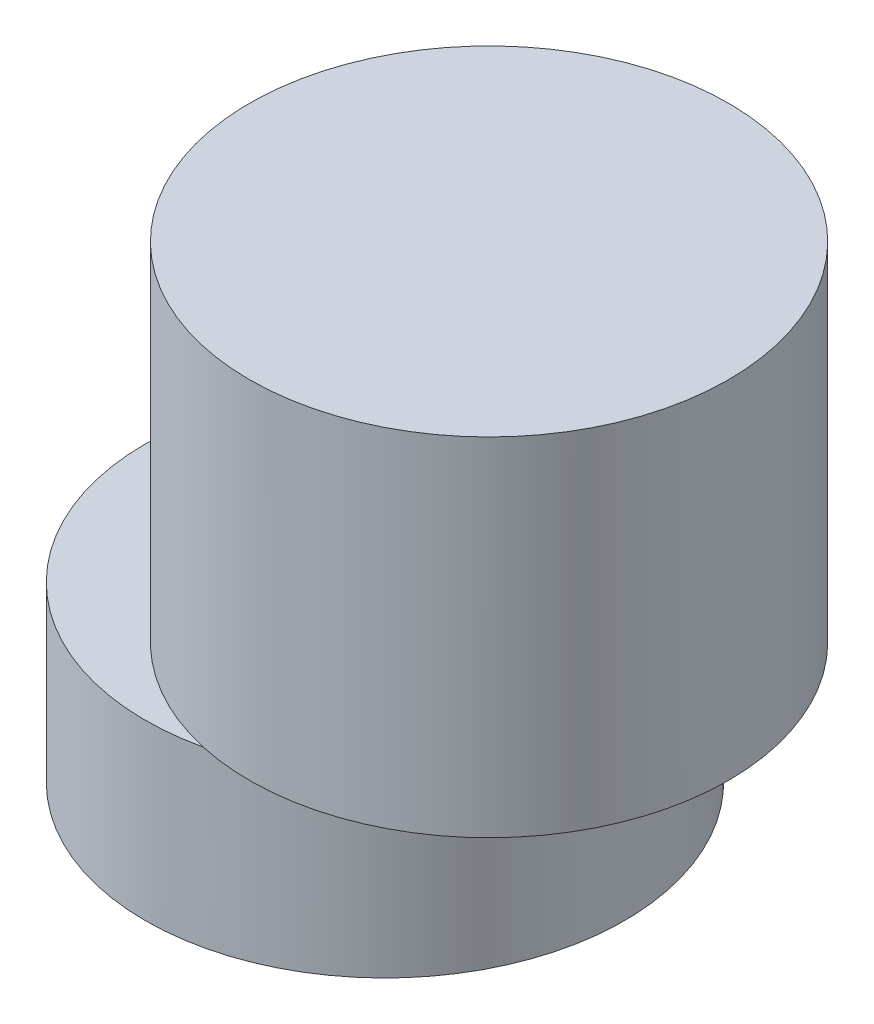
ISO-10303-21;
HEADER;
FILE_DESCRIPTION(('STEP AP214'),'2;1');
FILE_NAME('part.step','',(''),(''),'','','');
FILE_SCHEMA(('AUTOMOTIVE_DESIGN { 1 0 10303 214 1 1 1 1 }'));
ENDSEC;
DATA;
#1=APPLICATION_CONTEXT('core data for automotive mechanical design processes');
#2=APPLICATION_PROTOCOL_DEFINITION('international standard','automotive_design',2000,#1);
#3=PRODUCT_CONTEXT('',#1,'mechanical');
#4=PRODUCT('Part','Part','',(#3));
#5=PRODUCT_RELATED_PRODUCT_CATEGORY('part','',(#4));
#6=PRODUCT_DEFINITION_FORMATION('','',#4);
#7=PRODUCT_DEFINITION_CONTEXT('part definition',#1,'design');
#8=PRODUCT_DEFINITION('design','',#6,#7);
#9=PRODUCT_DEFINITION_SHAPE('','',#8);
#10=(LENGTH_UNIT() NAMED_UNIT(*) SI_UNIT(.MILLI.,.METRE.));
#11=(NAMED_UNIT(*) PLANE_ANGLE_UNIT() SI_UNIT($,.RADIAN.));
#12=(NAMED_UNIT(*) SI_UNIT($,.STERADIAN.) SOLID_ANGLE_UNIT());
#13=UNCERTAINTY_MEASURE_WITH_UNIT(LENGTH_MEASURE(1.E-05),#10,'distance_accuracy_value','');
#14=(GEOMETRIC_REPRESENTATION_CONTEXT(3) GLOBAL_UNCERTAINTY_ASSIGNED_CONTEXT((#13)) GLOBAL_UNIT_ASSIGNED_CONTEXT((#10,
#11,#12)) REPRESENTATION_CONTEXT('',''));
#15=CARTESIAN_POINT('',(0.,0.,0.));
#16=DIRECTION('',(0.,0.,1.));
#17=DIRECTION('',(1.,0.,0.));
#18=AXIS2_PLACEMENT_3D('',#15,#16,#17);
#19=CARTESIAN_POINT('',(0.,2.5,0.));
#20=DIRECTION('',(0.,-1.,0.));
#21=DIRECTION('',(0.,0.,-1.));
#22=AXIS2_PLACEMENT_3D('',#19,#20,#21);
#23=CYLINDRICAL_SURFACE('',#22,3.45);
#24=CARTESIAN_POINT('',(0.,2.5,0.));
#25=DIRECTION('',(0.,1.,0.));
#26=DIRECTION('',(0.,0.,1.));
#27=AXIS2_PLACEMENT_3D('',#24,#25,#26);
#28=CIRCLE('',#27,3.45);
#29=CARTESIAN_POINT('',(0.749999999999999,2.5,3.36749164809655));
#30=VERTEX_POINT('',#29);
#31=CARTESIAN_POINT('',(0.749999999999999,2.5,-3.36749164809655));
#32=VERTEX_POINT('',#31);
#33=EDGE_CURVE('E11',#30,#32,#28,.T.);
#34=ORIENTED_EDGE('',*,*,#33,.F.);
#35=EDGE_CURVE('E52',#32,#30,#28,.T.);
#36=ORIENTED_EDGE('',*,*,#35,.F.);
#37=EDGE_LOOP('',(#34,#36));
#38=FACE_BOUND('',#37,.T.);
#39=CARTESIAN_POINT('',(0.,0.,0.));
#40=DIRECTION('',(0.,1.,0.));
#41=DIRECTION('',(0.,0.,1.));
#42=AXIS2_PLACEMENT_3D('',#39,#40,#41);
#43=CIRCLE('',#42,3.45);
#44=CARTESIAN_POINT('',(0.,0.,3.45));
#45=VERTEX_POINT('',#44);
#46=EDGE_CURVE('E46',#45,#45,#43,.T.);
#47=ORIENTED_EDGE('',*,*,#46,.T.);
#48=EDGE_LOOP('',(#47));
#49=FACE_BOUND('',#48,.T.);
#50=ADVANCED_FACE('F43',(#38,#49),#23,.T.);
#51=CARTESIAN_POINT('',(0.,2.5,0.));
#52=DIRECTION('',(0.,1.,0.));
#53=DIRECTION('',(0.,0.,1.));
#54=AXIS2_PLACEMENT_3D('',#51,#52,#53);
#55=PLANE('',#54);
#56=CARTESIAN_POINT('',(1.5,2.5,0.));
#57=DIRECTION('',(0.,1.,0.));
#58=DIRECTION('',(0.,0.,1.));
#59=AXIS2_PLACEMENT_3D('',#56,#57,#58);
#60=CIRCLE('',#59,3.45);
#61=EDGE_CURVE('E58',#32,#30,#60,.T.);
#62=ORIENTED_EDGE('',*,*,#61,.F.);
#63=ORIENTED_EDGE('',*,*,#35,.T.);
#64=EDGE_LOOP('',(#62,#63));
#65=FACE_BOUND('',#64,.T.);
#66=ADVANCED_FACE('F66',(#65),#55,.T.);
#67=CARTESIAN_POINT('',(0.,0.,0.));
#68=DIRECTION('',(0.,1.,0.));
#69=DIRECTION('',(0.,0.,1.));
#70=AXIS2_PLACEMENT_3D('',#67,#68,#69);
#71=PLANE('',#70);
#72=ORIENTED_EDGE('',*,*,#46,.F.);
#73=EDGE_LOOP('',(#72));
#74=FACE_BOUND('',#73,.T.);
#75=ADVANCED_FACE('F85',(#74),#71,.F.);
#76=CARTESIAN_POINT('',(1.5,2.5,0.));
#77=DIRECTION('',(0.,1.,0.));
#78=DIRECTION('',(0.,0.,1.));
#79=AXIS2_PLACEMENT_3D('',#76,#77,#78);
#80=PLANE('',#79);
#81=EDGE_CURVE('E68',#30,#32,#60,.T.);
#82=ORIENTED_EDGE('',*,*,#81,.F.);
#83=ORIENTED_EDGE('',*,*,#33,.T.);
#84=EDGE_LOOP('',(#82,#83));
#85=FACE_BOUND('',#84,.T.);
#86=ADVANCED_FACE('F69',(#85),#80,.F.);
#87=CARTESIAN_POINT('',(1.5,7.5,0.));
#88=DIRECTION('',(0.,-1.,0.));
#89=DIRECTION('',(0.,0.,-1.));
#90=AXIS2_PLACEMENT_3D('',#87,#88,#89);
#91=CYLINDRICAL_SURFACE('',#90,3.45);
#92=CARTESIAN_POINT('',(1.5,7.5,0.));
#93=DIRECTION('',(0.,1.,0.));
#94=DIRECTION('',(0.,0.,1.));
#95=AXIS2_PLACEMENT_3D('',#92,#93,#94);
#96=CIRCLE('',#95,3.45);
#97=CARTESIAN_POINT('',(1.5,7.5,3.45));
#98=VERTEX_POINT('',#97);
#99=EDGE_CURVE('E75',#98,#98,#96,.T.);
#100=ORIENTED_EDGE('',*,*,#99,.F.);
#101=EDGE_LOOP('',(#100));
#102=FACE_BOUND('',#101,.T.);
#103=ORIENTED_EDGE('',*,*,#61,.T.);
#104=ORIENTED_EDGE('',*,*,#81,.T.);
#105=EDGE_LOOP('',(#103,#104));
#106=FACE_BOUND('',#105,.T.);
#107=ADVANCED_FACE('F73',(#102,#106),#91,.T.);
#108=CARTESIAN_POINT('',(1.5,7.5,0.));
#109=DIRECTION('',(0.,1.,0.));
#110=DIRECTION('',(0.,0.,1.));
#111=AXIS2_PLACEMENT_3D('',#108,#109,#110);
#112=PLANE('',#111);
#113=ORIENTED_EDGE('',*,*,#99,.T.);
#114=EDGE_LOOP('',(#113));
#115=FACE_BOUND('',#114,.T.);
#116=ADVANCED_FACE('F118',(#115),#112,.T.);
#117=CLOSED_SHELL('',(#50,#66,#75,#86,#107,#116));
#118=MANIFOLD_SOLID_BREP('B2',#117);
#119=ADVANCED_BREP_SHAPE_REPRESENTATION('',(#18,#118),#14);
#120=SHAPE_DEFINITION_REPRESENTATION(#9,#119);
ENDSEC;
END-ISO-10303-21;
